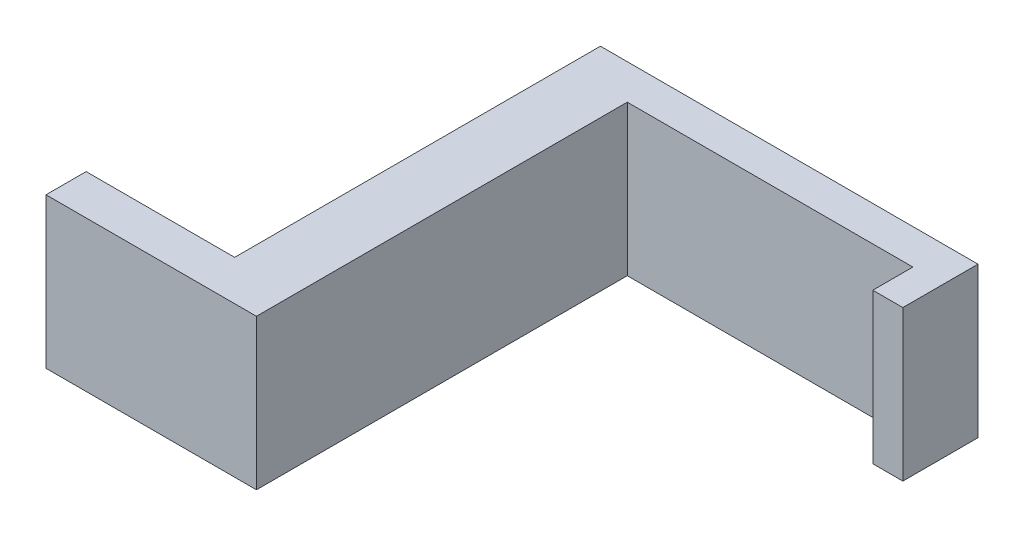
ISO-10303-21;
HEADER;
FILE_DESCRIPTION(('STEP AP214'),'2;1');
FILE_NAME('part.step','',(''),(''),'','','');
FILE_SCHEMA(('AUTOMOTIVE_DESIGN { 1 0 10303 214 1 1 1 1 }'));
ENDSEC;
DATA;
#1=APPLICATION_CONTEXT('core data for automotive mechanical design processes');
#2=APPLICATION_PROTOCOL_DEFINITION('international standard','automotive_design',2000,#1);
#3=PRODUCT_CONTEXT('',#1,'mechanical');
#4=PRODUCT('Part','Part','',(#3));
#5=PRODUCT_RELATED_PRODUCT_CATEGORY('part','',(#4));
#6=PRODUCT_DEFINITION_FORMATION('','',#4);
#7=PRODUCT_DEFINITION_CONTEXT('part definition',#1,'design');
#8=PRODUCT_DEFINITION('design','',#6,#7);
#9=PRODUCT_DEFINITION_SHAPE('','',#8);
#10=(LENGTH_UNIT() NAMED_UNIT(*) SI_UNIT(.MILLI.,.METRE.));
#11=(NAMED_UNIT(*) PLANE_ANGLE_UNIT() SI_UNIT($,.RADIAN.));
#12=(NAMED_UNIT(*) SI_UNIT($,.STERADIAN.) SOLID_ANGLE_UNIT());
#13=UNCERTAINTY_MEASURE_WITH_UNIT(LENGTH_MEASURE(1.E-05),#10,'distance_accuracy_value','');
#14=(GEOMETRIC_REPRESENTATION_CONTEXT(3) GLOBAL_UNCERTAINTY_ASSIGNED_CONTEXT((#13)) GLOBAL_UNIT_ASSIGNED_CONTEXT((#10,
#11,#12)) REPRESENTATION_CONTEXT('',''));
#15=CARTESIAN_POINT('',(0.,0.,0.));
#16=DIRECTION('',(0.,0.,1.));
#17=DIRECTION('',(1.,0.,0.));
#18=AXIS2_PLACEMENT_3D('',#15,#16,#17);
#19=CARTESIAN_POINT('',(0.,10.,0.));
#20=DIRECTION('',(-1.,0.,0.));
#21=DIRECTION('',(0.,0.,1.));
#22=AXIS2_PLACEMENT_3D('',#19,#20,#21);
#23=PLANE('',#22);
#24=DIRECTION('',(0.,0.,-1.));
#25=VECTOR('',#24,1.);
#26=CARTESIAN_POINT('',(0.,0.,0.));
#27=LINE('',#26,#25);
#28=CARTESIAN_POINT('',(0.,0.,2.67058535086798));
#29=VERTEX_POINT('',#28);
#30=CARTESIAN_POINT('',(0.,0.,-22.));
#31=VERTEX_POINT('',#30);
#32=EDGE_CURVE('E98',#29,#31,#27,.T.);
#33=ORIENTED_EDGE('',*,*,#32,.T.);
#34=DIRECTION('',(0.,-1.,0.));
#35=VECTOR('',#34,1.);
#36=CARTESIAN_POINT('',(0.,10.,-22.));
#37=LINE('',#36,#35);
#38=CARTESIAN_POINT('',(0.,10.,-22.));
#39=VERTEX_POINT('',#38);
#40=EDGE_CURVE('E11',#39,#31,#37,.T.);
#41=ORIENTED_EDGE('',*,*,#40,.F.);
#42=DIRECTION('',(0.,0.,-1.));
#43=VECTOR('',#42,1.);
#44=CARTESIAN_POINT('',(0.,10.,2.67058535086798));
#45=LINE('',#44,#43);
#46=CARTESIAN_POINT('',(0.,10.,2.67058535086798));
#47=VERTEX_POINT('',#46);
#48=EDGE_CURVE('E104',#47,#39,#45,.T.);
#49=ORIENTED_EDGE('',*,*,#48,.F.);
#50=DIRECTION('',(0.,-1.,0.));
#51=VECTOR('',#50,1.);
#52=CARTESIAN_POINT('',(0.,10.,2.67058535086798));
#53=LINE('',#52,#51);
#54=EDGE_CURVE('E148',#47,#29,#53,.T.);
#55=ORIENTED_EDGE('',*,*,#54,.T.);
#56=EDGE_LOOP('',(#33,#41,#49,#55));
#57=FACE_BOUND('',#56,.T.);
#58=ADVANCED_FACE('F39',(#57),#23,.F.);
#59=CARTESIAN_POINT('',(0.,10.,-22.));
#60=DIRECTION('',(0.,0.,-1.));
#61=DIRECTION('',(-1.,0.,0.));
#62=AXIS2_PLACEMENT_3D('',#59,#60,#61);
#63=PLANE('',#62);
#64=DIRECTION('',(1.,0.,0.));
#65=VECTOR('',#64,1.);
#66=CARTESIAN_POINT('',(0.,0.,-22.));
#67=LINE('',#66,#65);
#68=CARTESIAN_POINT('',(19.,0.,-22.));
#69=VERTEX_POINT('',#68);
#70=EDGE_CURVE('E154',#31,#69,#67,.T.);
#71=ORIENTED_EDGE('',*,*,#70,.T.);
#72=DIRECTION('',(0.,-1.,0.));
#73=VECTOR('',#72,1.);
#74=CARTESIAN_POINT('',(19.,10.,-22.));
#75=LINE('',#74,#73);
#76=CARTESIAN_POINT('',(19.,10.,-22.));
#77=VERTEX_POINT('',#76);
#78=EDGE_CURVE('E48',#77,#69,#75,.T.);
#79=ORIENTED_EDGE('',*,*,#78,.F.);
#80=DIRECTION('',(1.,0.,0.));
#81=VECTOR('',#80,1.);
#82=CARTESIAN_POINT('',(0.,10.,-22.));
#83=LINE('',#82,#81);
#84=EDGE_CURVE('E238',#39,#77,#83,.T.);
#85=ORIENTED_EDGE('',*,*,#84,.F.);
#86=ORIENTED_EDGE('',*,*,#40,.T.);
#87=EDGE_LOOP('',(#71,#79,#85,#86));
#88=FACE_BOUND('',#87,.T.);
#89=ADVANCED_FACE('F242',(#88),#63,.F.);
#90=CARTESIAN_POINT('',(19.,10.,-22.));
#91=DIRECTION('',(1.,0.,0.));
#92=DIRECTION('',(0.,0.,-1.));
#93=AXIS2_PLACEMENT_3D('',#90,#91,#92);
#94=PLANE('',#93);
#95=DIRECTION('',(0.,0.,1.));
#96=VECTOR('',#95,1.);
#97=CARTESIAN_POINT('',(19.,0.,-22.));
#98=LINE('',#97,#96);
#99=CARTESIAN_POINT('',(19.,0.,-19.3331422444453));
#100=VERTEX_POINT('',#99);
#101=EDGE_CURVE('E157',#69,#100,#98,.T.);
#102=ORIENTED_EDGE('',*,*,#101,.T.);
#103=DIRECTION('',(0.,-1.,0.));
#104=VECTOR('',#103,1.);
#105=CARTESIAN_POINT('',(19.,10.,-19.3331422444453));
#106=LINE('',#105,#104);
#107=CARTESIAN_POINT('',(19.,10.,-19.3331422444453));
#108=VERTEX_POINT('',#107);
#109=EDGE_CURVE('E198',#108,#100,#106,.T.);
#110=ORIENTED_EDGE('',*,*,#109,.F.);
#111=DIRECTION('',(0.,0.,1.));
#112=VECTOR('',#111,1.);
#113=CARTESIAN_POINT('',(19.,10.,-22.));
#114=LINE('',#113,#112);
#115=EDGE_CURVE('E209',#77,#108,#114,.T.);
#116=ORIENTED_EDGE('',*,*,#115,.F.);
#117=ORIENTED_EDGE('',*,*,#78,.T.);
#118=EDGE_LOOP('',(#102,#110,#116,#117));
#119=FACE_BOUND('',#118,.T.);
#120=ADVANCED_FACE('F207',(#119),#94,.F.);
#121=CARTESIAN_POINT('',(19.,10.,-19.3331422444453));
#122=DIRECTION('',(0.,0.,-1.));
#123=DIRECTION('',(-1.,0.,0.));
#124=AXIS2_PLACEMENT_3D('',#121,#122,#123);
#125=PLANE('',#124);
#126=DIRECTION('',(1.,0.,0.));
#127=VECTOR('',#126,1.);
#128=CARTESIAN_POINT('',(19.,0.,-19.3331422444453));
#129=LINE('',#128,#127);
#130=CARTESIAN_POINT('',(21.,0.,-19.3331422444453));
#131=VERTEX_POINT('',#130);
#132=EDGE_CURVE('E160',#100,#131,#129,.T.);
#133=ORIENTED_EDGE('',*,*,#132,.T.);
#134=DIRECTION('',(0.,-1.,0.));
#135=VECTOR('',#134,1.);
#136=CARTESIAN_POINT('',(21.,10.,-19.3331422444453));
#137=LINE('',#136,#135);
#138=CARTESIAN_POINT('',(21.,10.,-19.3331422444453));
#139=VERTEX_POINT('',#138);
#140=EDGE_CURVE('E194',#139,#131,#137,.T.);
#141=ORIENTED_EDGE('',*,*,#140,.F.);
#142=DIRECTION('',(1.,0.,0.));
#143=VECTOR('',#142,1.);
#144=CARTESIAN_POINT('',(19.,10.,-19.3331422444453));
#145=LINE('',#144,#143);
#146=EDGE_CURVE('E228',#108,#139,#145,.T.);
#147=ORIENTED_EDGE('',*,*,#146,.F.);
#148=ORIENTED_EDGE('',*,*,#109,.T.);
#149=EDGE_LOOP('',(#133,#141,#147,#148));
#150=FACE_BOUND('',#149,.T.);
#151=ADVANCED_FACE('F218',(#150),#125,.F.);
#152=CARTESIAN_POINT('',(21.,10.,-19.3331422444453));
#153=DIRECTION('',(-1.,0.,0.));
#154=DIRECTION('',(0.,0.,1.));
#155=AXIS2_PLACEMENT_3D('',#152,#153,#154);
#156=PLANE('',#155);
#157=DIRECTION('',(0.,0.,-1.));
#158=VECTOR('',#157,1.);
#159=CARTESIAN_POINT('',(21.,0.,-19.3331422444453));
#160=LINE('',#159,#158);
#161=CARTESIAN_POINT('',(21.,0.,-24.3331422444453));
#162=VERTEX_POINT('',#161);
#163=EDGE_CURVE('E163',#131,#162,#160,.T.);
#164=ORIENTED_EDGE('',*,*,#163,.T.);
#165=DIRECTION('',(0.,-1.,0.));
#166=VECTOR('',#165,1.);
#167=CARTESIAN_POINT('',(21.,10.,-24.3331422444453));
#168=LINE('',#167,#166);
#169=CARTESIAN_POINT('',(21.,10.,-24.3331422444453));
#170=VERTEX_POINT('',#169);
#171=EDGE_CURVE('E190',#170,#162,#168,.T.);
#172=ORIENTED_EDGE('',*,*,#171,.F.);
#173=DIRECTION('',(0.,0.,-1.));
#174=VECTOR('',#173,1.);
#175=CARTESIAN_POINT('',(21.,10.,-19.3331422444453));
#176=LINE('',#175,#174);
#177=EDGE_CURVE('E224',#139,#170,#176,.T.);
#178=ORIENTED_EDGE('',*,*,#177,.F.);
#179=ORIENTED_EDGE('',*,*,#140,.T.);
#180=EDGE_LOOP('',(#164,#172,#178,#179));
#181=FACE_BOUND('',#180,.T.);
#182=ADVANCED_FACE('F222',(#181),#156,.F.);
#183=CARTESIAN_POINT('',(21.,10.,-24.3331422444453));
#184=DIRECTION('',(0.,0.,1.));
#185=DIRECTION('',(1.,0.,0.));
#186=AXIS2_PLACEMENT_3D('',#183,#184,#185);
#187=PLANE('',#186);
#188=DIRECTION('',(-1.,0.,0.));
#189=VECTOR('',#188,1.);
#190=CARTESIAN_POINT('',(21.,0.,-24.3331422444453));
#191=LINE('',#190,#189);
#192=CARTESIAN_POINT('',(-4.11950169176037,0.,-24.3331422444453));
#193=VERTEX_POINT('',#192);
#194=EDGE_CURVE('E166',#162,#193,#191,.T.);
#195=ORIENTED_EDGE('',*,*,#194,.T.);
#196=DIRECTION('',(0.,-1.,0.));
#197=VECTOR('',#196,1.);
#198=CARTESIAN_POINT('',(-4.11950169176037,10.,-24.3331422444453));
#199=LINE('',#198,#197);
#200=CARTESIAN_POINT('',(-4.11950169176037,10.,-24.3331422444453));
#201=VERTEX_POINT('',#200);
#202=EDGE_CURVE('E186',#201,#193,#199,.T.);
#203=ORIENTED_EDGE('',*,*,#202,.F.);
#204=DIRECTION('',(-1.,0.,0.));
#205=VECTOR('',#204,1.);
#206=CARTESIAN_POINT('',(21.,10.,-24.3331422444453));
#207=LINE('',#206,#205);
#208=EDGE_CURVE('E227',#170,#201,#207,.T.);
#209=ORIENTED_EDGE('',*,*,#208,.F.);
#210=ORIENTED_EDGE('',*,*,#171,.T.);
#211=EDGE_LOOP('',(#195,#203,#209,#210));
#212=FACE_BOUND('',#211,.T.);
#213=ADVANCED_FACE('F251',(#212),#187,.F.);
#214=CARTESIAN_POINT('',(-4.11950169176037,10.,-24.3331422444453));
#215=DIRECTION('',(1.,0.,0.));
#216=DIRECTION('',(0.,0.,-1.));
#217=AXIS2_PLACEMENT_3D('',#214,#215,#216);
#218=PLANE('',#217);
#219=DIRECTION('',(0.,0.,1.));
#220=VECTOR('',#219,1.);
#221=CARTESIAN_POINT('',(-4.11950169176037,0.,-24.3331422444453));
#222=LINE('',#221,#220);
#223=CARTESIAN_POINT('',(-4.11950169176037,0.,0.));
#224=VERTEX_POINT('',#223);
#225=EDGE_CURVE('E169',#193,#224,#222,.T.);
#226=ORIENTED_EDGE('',*,*,#225,.T.);
#227=DIRECTION('',(0.,-1.,0.));
#228=VECTOR('',#227,1.);
#229=CARTESIAN_POINT('',(-4.11950169176037,10.,0.));
#230=LINE('',#229,#228);
#231=CARTESIAN_POINT('',(-4.11950169176037,10.,0.));
#232=VERTEX_POINT('',#231);
#233=EDGE_CURVE('E141',#232,#224,#230,.T.);
#234=ORIENTED_EDGE('',*,*,#233,.F.);
#235=DIRECTION('',(0.,0.,1.));
#236=VECTOR('',#235,1.);
#237=CARTESIAN_POINT('',(-4.11950169176037,10.,-24.3331422444453));
#238=LINE('',#237,#236);
#239=EDGE_CURVE('E130',#201,#232,#238,.T.);
#240=ORIENTED_EDGE('',*,*,#239,.F.);
#241=ORIENTED_EDGE('',*,*,#202,.T.);
#242=EDGE_LOOP('',(#226,#234,#240,#241));
#243=FACE_BOUND('',#242,.T.);
#244=ADVANCED_FACE('F248',(#243),#218,.F.);
#245=CARTESIAN_POINT('',(-4.11950169176037,10.,0.));
#246=DIRECTION('',(0.,0.,1.));
#247=DIRECTION('',(1.,0.,0.));
#248=AXIS2_PLACEMENT_3D('',#245,#246,#247);
#249=PLANE('',#248);
#250=DIRECTION('',(-1.,0.,0.));
#251=VECTOR('',#250,1.);
#252=CARTESIAN_POINT('',(-4.11950169176037,0.,0.));
#253=LINE('',#252,#251);
#254=CARTESIAN_POINT('',(-14.,0.,0.));
#255=VERTEX_POINT('',#254);
#256=EDGE_CURVE('E139',#224,#255,#253,.T.);
#257=ORIENTED_EDGE('',*,*,#256,.T.);
#258=DIRECTION('',(0.,-1.,0.));
#259=VECTOR('',#258,1.);
#260=CARTESIAN_POINT('',(-14.,10.,0.));
#261=LINE('',#260,#259);
#262=CARTESIAN_POINT('',(-14.,10.,0.));
#263=VERTEX_POINT('',#262);
#264=EDGE_CURVE('E136',#263,#255,#261,.T.);
#265=ORIENTED_EDGE('',*,*,#264,.F.);
#266=DIRECTION('',(-1.,0.,0.));
#267=VECTOR('',#266,1.);
#268=CARTESIAN_POINT('',(-4.11950169176037,10.,0.));
#269=LINE('',#268,#267);
#270=EDGE_CURVE('E124',#232,#263,#269,.T.);
#271=ORIENTED_EDGE('',*,*,#270,.F.);
#272=ORIENTED_EDGE('',*,*,#233,.T.);
#273=EDGE_LOOP('',(#257,#265,#271,#272));
#274=FACE_BOUND('',#273,.T.);
#275=ADVANCED_FACE('F137',(#274),#249,.F.);
#276=CARTESIAN_POINT('',(-14.,10.,0.));
#277=DIRECTION('',(1.,0.,0.));
#278=DIRECTION('',(0.,0.,-1.));
#279=AXIS2_PLACEMENT_3D('',#276,#277,#278);
#280=PLANE('',#279);
#281=DIRECTION('',(0.,0.,1.));
#282=VECTOR('',#281,1.);
#283=CARTESIAN_POINT('',(-14.,0.,0.));
#284=LINE('',#283,#282);
#285=CARTESIAN_POINT('',(-14.,0.,2.67058535086798));
#286=VERTEX_POINT('',#285);
#287=EDGE_CURVE('E91',#255,#286,#284,.T.);
#288=ORIENTED_EDGE('',*,*,#287,.T.);
#289=DIRECTION('',(0.,-1.,0.));
#290=VECTOR('',#289,1.);
#291=CARTESIAN_POINT('',(-14.,10.,2.67058535086798));
#292=LINE('',#291,#290);
#293=CARTESIAN_POINT('',(-14.,10.,2.67058535086798));
#294=VERTEX_POINT('',#293);
#295=EDGE_CURVE('E142',#294,#286,#292,.T.);
#296=ORIENTED_EDGE('',*,*,#295,.F.);
#297=DIRECTION('',(0.,0.,1.));
#298=VECTOR('',#297,1.);
#299=CARTESIAN_POINT('',(-14.,10.,0.));
#300=LINE('',#299,#298);
#301=EDGE_CURVE('E128',#263,#294,#300,.T.);
#302=ORIENTED_EDGE('',*,*,#301,.F.);
#303=ORIENTED_EDGE('',*,*,#264,.T.);
#304=EDGE_LOOP('',(#288,#296,#302,#303));
#305=FACE_BOUND('',#304,.T.);
#306=ADVANCED_FACE('F144',(#305),#280,.F.);
#307=CARTESIAN_POINT('',(-14.,10.,2.67058535086798));
#308=DIRECTION('',(0.,0.,-1.));
#309=DIRECTION('',(-1.,0.,0.));
#310=AXIS2_PLACEMENT_3D('',#307,#308,#309);
#311=PLANE('',#310);
#312=DIRECTION('',(1.,0.,0.));
#313=VECTOR('',#312,1.);
#314=CARTESIAN_POINT('',(-14.,0.,2.67058535086798));
#315=LINE('',#314,#313);
#316=EDGE_CURVE('E176',#286,#29,#315,.T.);
#317=ORIENTED_EDGE('',*,*,#316,.T.);
#318=ORIENTED_EDGE('',*,*,#54,.F.);
#319=DIRECTION('',(1.,0.,0.));
#320=VECTOR('',#319,1.);
#321=CARTESIAN_POINT('',(-14.,10.,2.67058535086798));
#322=LINE('',#321,#320);
#323=EDGE_CURVE('E56',#294,#47,#322,.T.);
#324=ORIENTED_EDGE('',*,*,#323,.F.);
#325=ORIENTED_EDGE('',*,*,#295,.T.);
#326=EDGE_LOOP('',(#317,#318,#324,#325));
#327=FACE_BOUND('',#326,.T.);
#328=ADVANCED_FACE('F245',(#327),#311,.F.);
#329=CARTESIAN_POINT('',(0.,10.,0.));
#330=DIRECTION('',(0.,-1.,0.));
#331=DIRECTION('',(0.,0.,-1.));
#332=AXIS2_PLACEMENT_3D('',#329,#330,#331);
#333=PLANE('',#332);
#334=ORIENTED_EDGE('',*,*,#48,.T.);
#335=ORIENTED_EDGE('',*,*,#84,.T.);
#336=ORIENTED_EDGE('',*,*,#115,.T.);
#337=ORIENTED_EDGE('',*,*,#146,.T.);
#338=ORIENTED_EDGE('',*,*,#177,.T.);
#339=ORIENTED_EDGE('',*,*,#208,.T.);
#340=ORIENTED_EDGE('',*,*,#239,.T.);
#341=ORIENTED_EDGE('',*,*,#270,.T.);
#342=ORIENTED_EDGE('',*,*,#301,.T.);
#343=ORIENTED_EDGE('',*,*,#323,.T.);
#344=EDGE_LOOP('',(#334,#335,#336,#337,#338,#339,#340,#341,#342,#343));
#345=FACE_BOUND('',#344,.T.);
#346=ADVANCED_FACE('F126',(#345),#333,.F.);
#347=CARTESIAN_POINT('',(0.,0.,0.));
#348=DIRECTION('',(0.,-1.,0.));
#349=DIRECTION('',(0.,0.,-1.));
#350=AXIS2_PLACEMENT_3D('',#347,#348,#349);
#351=PLANE('',#350);
#352=ORIENTED_EDGE('',*,*,#32,.F.);
#353=ORIENTED_EDGE('',*,*,#316,.F.);
#354=ORIENTED_EDGE('',*,*,#287,.F.);
#355=ORIENTED_EDGE('',*,*,#256,.F.);
#356=ORIENTED_EDGE('',*,*,#225,.F.);
#357=ORIENTED_EDGE('',*,*,#194,.F.);
#358=ORIENTED_EDGE('',*,*,#163,.F.);
#359=ORIENTED_EDGE('',*,*,#132,.F.);
#360=ORIENTED_EDGE('',*,*,#101,.F.);
#361=ORIENTED_EDGE('',*,*,#70,.F.);
#362=EDGE_LOOP('',(#352,#353,#354,#355,#356,#357,#358,#359,#360,#361));
#363=FACE_BOUND('',#362,.T.);
#364=ADVANCED_FACE('F213',(#363),#351,.T.);
#365=CLOSED_SHELL('',(#58,#89,#120,#151,#182,#213,#244,#275,#306,#328,#346,#364));
#366=MANIFOLD_SOLID_BREP('B2',#365);
#367=ADVANCED_BREP_SHAPE_REPRESENTATION('',(#18,#366),#14);
#368=SHAPE_DEFINITION_REPRESENTATION(#9,#367);
ENDSEC;
END-ISO-10303-21;
